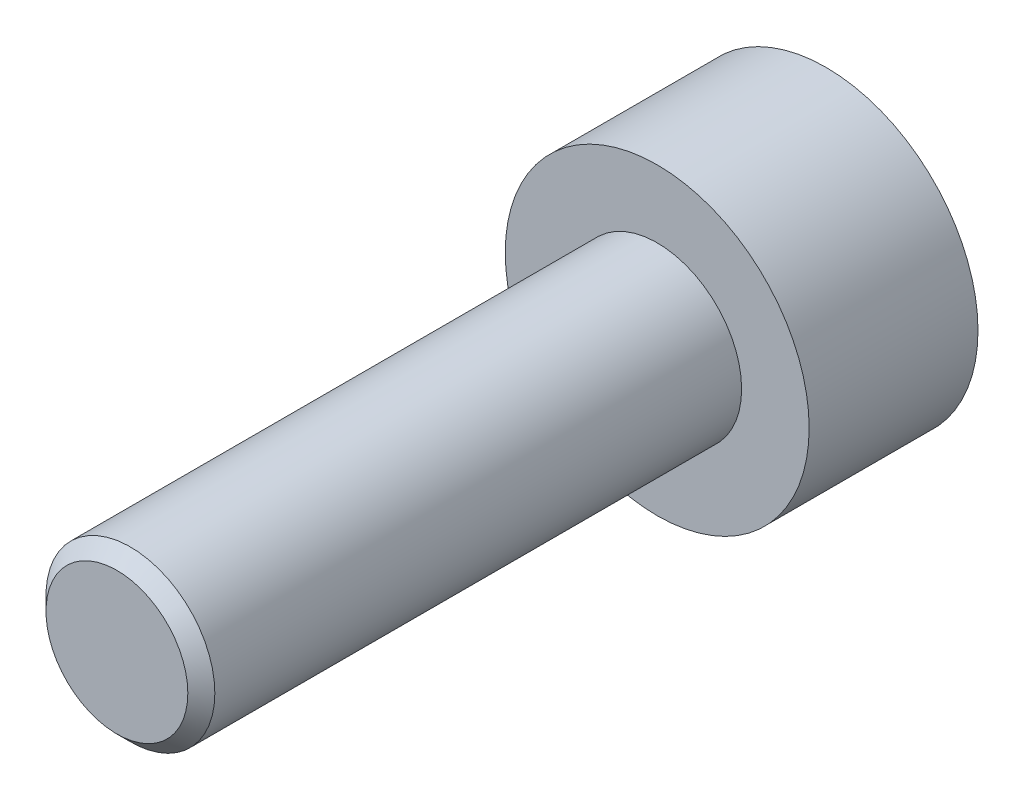
ISO-10303-21;
HEADER;
FILE_DESCRIPTION(('STEP AP214'),'2;1');
FILE_NAME('part.step','',(''),(''),'','','');
FILE_SCHEMA(('AUTOMOTIVE_DESIGN { 1 0 10303 214 1 1 1 1 }'));
ENDSEC;
DATA;
#1=APPLICATION_CONTEXT('core data for automotive mechanical design processes');
#2=APPLICATION_PROTOCOL_DEFINITION('international standard','automotive_design',2000,#1);
#3=PRODUCT_CONTEXT('',#1,'mechanical');
#4=PRODUCT('Part','Part','',(#3));
#5=PRODUCT_RELATED_PRODUCT_CATEGORY('part','',(#4));
#6=PRODUCT_DEFINITION_FORMATION('','',#4);
#7=PRODUCT_DEFINITION_CONTEXT('part definition',#1,'design');
#8=PRODUCT_DEFINITION('design','',#6,#7);
#9=PRODUCT_DEFINITION_SHAPE('','',#8);
#10=(LENGTH_UNIT() NAMED_UNIT(*) SI_UNIT(.MILLI.,.METRE.));
#11=(NAMED_UNIT(*) PLANE_ANGLE_UNIT() SI_UNIT($,.RADIAN.));
#12=(NAMED_UNIT(*) SI_UNIT($,.STERADIAN.) SOLID_ANGLE_UNIT());
#13=UNCERTAINTY_MEASURE_WITH_UNIT(LENGTH_MEASURE(1.E-05),#10,'distance_accuracy_value','');
#14=(GEOMETRIC_REPRESENTATION_CONTEXT(3) GLOBAL_UNCERTAINTY_ASSIGNED_CONTEXT((#13)) GLOBAL_UNIT_ASSIGNED_CONTEXT((#10,
#11,#12)) REPRESENTATION_CONTEXT('',''));
#15=CARTESIAN_POINT('',(0.,0.,0.));
#16=DIRECTION('',(0.,0.,1.));
#17=DIRECTION('',(1.,0.,0.));
#18=AXIS2_PLACEMENT_3D('',#15,#16,#17);
#19=CARTESIAN_POINT('',(0.,0.,2.5));
#20=DIRECTION('',(0.,0.,-1.));
#21=DIRECTION('',(-1.,0.,0.));
#22=AXIS2_PLACEMENT_3D('',#19,#20,#21);
#23=CYLINDRICAL_SURFACE('',#22,2.25);
#24=CARTESIAN_POINT('',(0.,0.,2.5));
#25=DIRECTION('',(0.,0.,1.));
#26=DIRECTION('',(1.,0.,0.));
#27=AXIS2_PLACEMENT_3D('',#24,#25,#26);
#28=CIRCLE('',#27,2.25);
#29=CARTESIAN_POINT('',(2.25,0.,2.5));
#30=VERTEX_POINT('',#29);
#31=EDGE_CURVE('E171',#30,#30,#28,.T.);
#32=ORIENTED_EDGE('',*,*,#31,.F.);
#33=EDGE_LOOP('',(#32));
#34=FACE_BOUND('',#33,.T.);
#35=CARTESIAN_POINT('',(0.,0.,0.));
#36=DIRECTION('',(0.,0.,1.));
#37=DIRECTION('',(1.,0.,0.));
#38=AXIS2_PLACEMENT_3D('',#35,#36,#37);
#39=CIRCLE('',#38,2.25);
#40=CARTESIAN_POINT('',(2.25,0.,0.));
#41=VERTEX_POINT('',#40);
#42=EDGE_CURVE('E157',#41,#41,#39,.T.);
#43=ORIENTED_EDGE('',*,*,#42,.T.);
#44=EDGE_LOOP('',(#43));
#45=FACE_BOUND('',#44,.T.);
#46=ADVANCED_FACE('F41',(#34,#45),#23,.T.);
#47=CARTESIAN_POINT('',(0.,0.,2.5));
#48=DIRECTION('',(0.,0.,1.));
#49=DIRECTION('',(1.,0.,0.));
#50=AXIS2_PLACEMENT_3D('',#47,#48,#49);
#51=PLANE('',#50);
#52=CARTESIAN_POINT('',(0.,0.,2.5));
#53=DIRECTION('',(0.,0.,1.));
#54=DIRECTION('',(1.,0.,0.));
#55=AXIS2_PLACEMENT_3D('',#52,#53,#54);
#56=CIRCLE('',#55,1.25);
#57=CARTESIAN_POINT('',(1.25,0.,2.5));
#58=VERTEX_POINT('',#57);
#59=EDGE_CURVE('E167',#58,#58,#56,.T.);
#60=ORIENTED_EDGE('',*,*,#59,.F.);
#61=EDGE_LOOP('',(#60));
#62=FACE_BOUND('',#61,.T.);
#63=ORIENTED_EDGE('',*,*,#31,.T.);
#64=EDGE_LOOP('',(#63));
#65=FACE_BOUND('',#64,.T.);
#66=ADVANCED_FACE('F196',(#62,#65),#51,.T.);
#67=CARTESIAN_POINT('',(0.,0.,0.));
#68=DIRECTION('',(0.,0.,1.));
#69=DIRECTION('',(1.,0.,0.));
#70=AXIS2_PLACEMENT_3D('',#67,#68,#69);
#71=PLANE('',#70);
#72=DIRECTION('',(0.866025403784439,-0.5,0.));
#73=VECTOR('',#72,1.);
#74=CARTESIAN_POINT('',(0.,1.17779454914684,0.));
#75=LINE('',#74,#73);
#76=CARTESIAN_POINT('',(0.,1.17779454914684,0.));
#77=VERTEX_POINT('',#76);
#78=CARTESIAN_POINT('',(1.02,0.588897274573418,0.));
#79=VERTEX_POINT('',#78);
#80=EDGE_CURVE('E138',#77,#79,#75,.T.);
#81=ORIENTED_EDGE('',*,*,#80,.F.);
#82=DIRECTION('',(0.866025403784439,0.5,0.));
#83=VECTOR('',#82,1.);
#84=CARTESIAN_POINT('',(-1.02,0.588897274573418,0.));
#85=LINE('',#84,#83);
#86=CARTESIAN_POINT('',(-1.02,0.588897274573418,0.));
#87=VERTEX_POINT('',#86);
#88=EDGE_CURVE('E58',#87,#77,#85,.T.);
#89=ORIENTED_EDGE('',*,*,#88,.F.);
#90=DIRECTION('',(0.,1.,0.));
#91=VECTOR('',#90,1.);
#92=CARTESIAN_POINT('',(-1.02,-0.588897274573418,0.));
#93=LINE('',#92,#91);
#94=CARTESIAN_POINT('',(-1.02,-0.588897274573418,0.));
#95=VERTEX_POINT('',#94);
#96=EDGE_CURVE('E151',#95,#87,#93,.T.);
#97=ORIENTED_EDGE('',*,*,#96,.F.);
#98=DIRECTION('',(-0.866025403784439,0.5,0.));
#99=VECTOR('',#98,1.);
#100=CARTESIAN_POINT('',(0.,-1.17779454914684,0.));
#101=LINE('',#100,#99);
#102=CARTESIAN_POINT('',(0.,-1.17779454914684,0.));
#103=VERTEX_POINT('',#102);
#104=EDGE_CURVE('E148',#103,#95,#101,.T.);
#105=ORIENTED_EDGE('',*,*,#104,.F.);
#106=DIRECTION('',(-0.866025403784439,-0.5,0.));
#107=VECTOR('',#106,1.);
#108=CARTESIAN_POINT('',(1.02,-0.588897274573418,0.));
#109=LINE('',#108,#107);
#110=CARTESIAN_POINT('',(1.02,-0.588897274573418,0.));
#111=VERTEX_POINT('',#110);
#112=EDGE_CURVE('E106',#111,#103,#109,.T.);
#113=ORIENTED_EDGE('',*,*,#112,.F.);
#114=DIRECTION('',(0.,-1.,0.));
#115=VECTOR('',#114,1.);
#116=CARTESIAN_POINT('',(1.02,0.588897274573418,0.));
#117=LINE('',#116,#115);
#118=EDGE_CURVE('E142',#79,#111,#117,.T.);
#119=ORIENTED_EDGE('',*,*,#118,.F.);
#120=EDGE_LOOP('',(#81,#89,#97,#105,#113,#119));
#121=FACE_BOUND('',#120,.T.);
#122=ORIENTED_EDGE('',*,*,#42,.F.);
#123=EDGE_LOOP('',(#122));
#124=FACE_BOUND('',#123,.T.);
#125=ADVANCED_FACE('F201',(#121,#124),#71,.F.);
#126=CARTESIAN_POINT('',(0.,0.,10.5));
#127=DIRECTION('',(0.,0.,-1.));
#128=DIRECTION('',(-1.,0.,0.));
#129=AXIS2_PLACEMENT_3D('',#126,#127,#128);
#130=CYLINDRICAL_SURFACE('',#129,1.25);
#131=CARTESIAN_POINT('',(0.,0.,10.3));
#132=DIRECTION('',(0.,0.,1.));
#133=DIRECTION('',(1.,0.,0.));
#134=AXIS2_PLACEMENT_3D('',#131,#132,#133);
#135=CIRCLE('',#134,1.25);
#136=CARTESIAN_POINT('',(1.25,0.,10.3));
#137=VERTEX_POINT('',#136);
#138=EDGE_CURVE('E11',#137,#137,#135,.F.);
#139=ORIENTED_EDGE('',*,*,#138,.T.);
#140=EDGE_LOOP('',(#139));
#141=FACE_BOUND('',#140,.T.);
#142=ORIENTED_EDGE('',*,*,#59,.T.);
#143=EDGE_LOOP('',(#142));
#144=FACE_BOUND('',#143,.T.);
#145=ADVANCED_FACE('F192',(#141,#144),#130,.T.);
#146=CARTESIAN_POINT('',(0.,0.,10.5));
#147=DIRECTION('',(0.,0.,1.));
#148=DIRECTION('',(1.,0.,0.));
#149=AXIS2_PLACEMENT_3D('',#146,#147,#148);
#150=PLANE('',#149);
#151=CARTESIAN_POINT('',(0.,0.,10.5));
#152=DIRECTION('',(0.,0.,1.));
#153=DIRECTION('',(1.,0.,0.));
#154=AXIS2_PLACEMENT_3D('',#151,#152,#153);
#155=CIRCLE('',#154,1.05);
#156=CARTESIAN_POINT('',(1.05,0.,10.5));
#157=VERTEX_POINT('',#156);
#158=EDGE_CURVE('E51',#157,#157,#155,.T.);
#159=ORIENTED_EDGE('',*,*,#158,.T.);
#160=EDGE_LOOP('',(#159));
#161=FACE_BOUND('',#160,.T.);
#162=ADVANCED_FACE('F181',(#161),#150,.T.);
#163=CARTESIAN_POINT('',(0.,0.,10.5));
#164=DIRECTION('',(0.,0.,-1.));
#165=DIRECTION('',(-1.,0.,0.));
#166=AXIS2_PLACEMENT_3D('',#163,#164,#165);
#167=CONICAL_SURFACE('',#166,1.05,0.785398163397446);
#168=ORIENTED_EDGE('',*,*,#138,.F.);
#169=EDGE_LOOP('',(#168));
#170=FACE_BOUND('',#169,.T.);
#171=ORIENTED_EDGE('',*,*,#158,.F.);
#172=EDGE_LOOP('',(#171));
#173=FACE_BOUND('',#172,.T.);
#174=ADVANCED_FACE('F44',(#170,#173),#167,.T.);
#175=CARTESIAN_POINT('',(-1.02,0.588897274573418,1.1));
#176=DIRECTION('',(-0.5,0.866025403784439,0.));
#177=DIRECTION('',(-0.866025403784439,-0.5,0.));
#178=AXIS2_PLACEMENT_3D('',#175,#176,#177);
#179=PLANE('',#178);
#180=ORIENTED_EDGE('',*,*,#88,.T.);
#181=DIRECTION('',(0.,0.,-1.));
#182=VECTOR('',#181,1.);
#183=CARTESIAN_POINT('',(0.,1.17779454914684,1.1));
#184=LINE('',#183,#182);
#185=CARTESIAN_POINT('',(0.,1.17779454914684,1.1));
#186=VERTEX_POINT('',#185);
#187=EDGE_CURVE('E88',#186,#77,#184,.T.);
#188=ORIENTED_EDGE('',*,*,#187,.F.);
#189=DIRECTION('',(0.866025403784439,0.5,0.));
#190=VECTOR('',#189,1.);
#191=CARTESIAN_POINT('',(-1.02,0.588897274573418,1.1));
#192=LINE('',#191,#190);
#193=CARTESIAN_POINT('',(-1.02,0.588897274573418,1.1));
#194=VERTEX_POINT('',#193);
#195=EDGE_CURVE('E154',#194,#186,#192,.T.);
#196=ORIENTED_EDGE('',*,*,#195,.F.);
#197=DIRECTION('',(0.,0.,-1.));
#198=VECTOR('',#197,1.);
#199=CARTESIAN_POINT('',(-1.02,0.588897274573418,1.1));
#200=LINE('',#199,#198);
#201=EDGE_CURVE('E66',#194,#87,#200,.T.);
#202=ORIENTED_EDGE('',*,*,#201,.T.);
#203=EDGE_LOOP('',(#180,#188,#196,#202));
#204=FACE_BOUND('',#203,.T.);
#205=ADVANCED_FACE('F184',(#204),#179,.F.);
#206=CARTESIAN_POINT('',(-1.02,-0.588897274573418,1.1));
#207=DIRECTION('',(-1.,0.,0.));
#208=DIRECTION('',(0.,0.,1.));
#209=AXIS2_PLACEMENT_3D('',#206,#207,#208);
#210=PLANE('',#209);
#211=ORIENTED_EDGE('',*,*,#96,.T.);
#212=ORIENTED_EDGE('',*,*,#201,.F.);
#213=DIRECTION('',(0.,1.,0.));
#214=VECTOR('',#213,1.);
#215=CARTESIAN_POINT('',(-1.02,-0.588897274573418,1.1));
#216=LINE('',#215,#214);
#217=CARTESIAN_POINT('',(-1.02,-0.588897274573418,1.1));
#218=VERTEX_POINT('',#217);
#219=EDGE_CURVE('E120',#218,#194,#216,.T.);
#220=ORIENTED_EDGE('',*,*,#219,.F.);
#221=DIRECTION('',(0.,0.,-1.));
#222=VECTOR('',#221,1.);
#223=CARTESIAN_POINT('',(-1.02,-0.588897274573418,1.1));
#224=LINE('',#223,#222);
#225=EDGE_CURVE('E111',#218,#95,#224,.T.);
#226=ORIENTED_EDGE('',*,*,#225,.T.);
#227=EDGE_LOOP('',(#211,#212,#220,#226));
#228=FACE_BOUND('',#227,.T.);
#229=ADVANCED_FACE('F190',(#228),#210,.F.);
#230=CARTESIAN_POINT('',(0.,-1.17779454914684,1.1));
#231=DIRECTION('',(-0.5,-0.866025403784439,0.));
#232=DIRECTION('',(0.866025403784439,-0.5,0.));
#233=AXIS2_PLACEMENT_3D('',#230,#231,#232);
#234=PLANE('',#233);
#235=ORIENTED_EDGE('',*,*,#104,.T.);
#236=ORIENTED_EDGE('',*,*,#225,.F.);
#237=DIRECTION('',(-0.866025403784439,0.5,0.));
#238=VECTOR('',#237,1.);
#239=CARTESIAN_POINT('',(0.,-1.17779454914684,1.1));
#240=LINE('',#239,#238);
#241=CARTESIAN_POINT('',(0.,-1.17779454914684,1.1));
#242=VERTEX_POINT('',#241);
#243=EDGE_CURVE('E115',#242,#218,#240,.T.);
#244=ORIENTED_EDGE('',*,*,#243,.F.);
#245=DIRECTION('',(0.,0.,-1.));
#246=VECTOR('',#245,1.);
#247=CARTESIAN_POINT('',(0.,-1.17779454914684,1.1));
#248=LINE('',#247,#246);
#249=EDGE_CURVE('E99',#242,#103,#248,.T.);
#250=ORIENTED_EDGE('',*,*,#249,.T.);
#251=EDGE_LOOP('',(#235,#236,#244,#250));
#252=FACE_BOUND('',#251,.T.);
#253=ADVANCED_FACE('F116',(#252),#234,.F.);
#254=CARTESIAN_POINT('',(1.02,-0.588897274573418,1.1));
#255=DIRECTION('',(0.5,-0.866025403784439,0.));
#256=DIRECTION('',(0.866025403784439,0.5,0.));
#257=AXIS2_PLACEMENT_3D('',#254,#255,#256);
#258=PLANE('',#257);
#259=ORIENTED_EDGE('',*,*,#112,.T.);
#260=ORIENTED_EDGE('',*,*,#249,.F.);
#261=DIRECTION('',(-0.866025403784439,-0.5,0.));
#262=VECTOR('',#261,1.);
#263=CARTESIAN_POINT('',(1.02,-0.588897274573418,1.1));
#264=LINE('',#263,#262);
#265=CARTESIAN_POINT('',(1.02,-0.588897274573418,1.1));
#266=VERTEX_POINT('',#265);
#267=EDGE_CURVE('E103',#266,#242,#264,.T.);
#268=ORIENTED_EDGE('',*,*,#267,.F.);
#269=DIRECTION('',(0.,0.,-1.));
#270=VECTOR('',#269,1.);
#271=CARTESIAN_POINT('',(1.02,-0.588897274573418,1.1));
#272=LINE('',#271,#270);
#273=EDGE_CURVE('E112',#266,#111,#272,.T.);
#274=ORIENTED_EDGE('',*,*,#273,.T.);
#275=EDGE_LOOP('',(#259,#260,#268,#274));
#276=FACE_BOUND('',#275,.T.);
#277=ADVANCED_FACE('F101',(#276),#258,.F.);
#278=CARTESIAN_POINT('',(1.02,0.588897274573418,1.1));
#279=DIRECTION('',(1.,0.,0.));
#280=DIRECTION('',(0.,0.,-1.));
#281=AXIS2_PLACEMENT_3D('',#278,#279,#280);
#282=PLANE('',#281);
#283=ORIENTED_EDGE('',*,*,#118,.T.);
#284=ORIENTED_EDGE('',*,*,#273,.F.);
#285=DIRECTION('',(0.,-1.,0.));
#286=VECTOR('',#285,1.);
#287=CARTESIAN_POINT('',(1.02,0.588897274573418,1.1));
#288=LINE('',#287,#286);
#289=CARTESIAN_POINT('',(1.02,0.588897274573418,1.1));
#290=VERTEX_POINT('',#289);
#291=EDGE_CURVE('E126',#290,#266,#288,.T.);
#292=ORIENTED_EDGE('',*,*,#291,.F.);
#293=DIRECTION('',(0.,0.,-1.));
#294=VECTOR('',#293,1.);
#295=CARTESIAN_POINT('',(1.02,0.588897274573418,1.1));
#296=LINE('',#295,#294);
#297=EDGE_CURVE('E162',#290,#79,#296,.T.);
#298=ORIENTED_EDGE('',*,*,#297,.T.);
#299=EDGE_LOOP('',(#283,#284,#292,#298));
#300=FACE_BOUND('',#299,.T.);
#301=ADVANCED_FACE('F216',(#300),#282,.F.);
#302=CARTESIAN_POINT('',(0.,1.17779454914684,1.1));
#303=DIRECTION('',(0.5,0.866025403784439,0.));
#304=DIRECTION('',(-0.866025403784439,0.5,0.));
#305=AXIS2_PLACEMENT_3D('',#302,#303,#304);
#306=PLANE('',#305);
#307=ORIENTED_EDGE('',*,*,#80,.T.);
#308=ORIENTED_EDGE('',*,*,#297,.F.);
#309=DIRECTION('',(0.866025403784439,-0.5,0.));
#310=VECTOR('',#309,1.);
#311=CARTESIAN_POINT('',(0.,1.17779454914684,1.1));
#312=LINE('',#311,#310);
#313=EDGE_CURVE('E130',#186,#290,#312,.T.);
#314=ORIENTED_EDGE('',*,*,#313,.F.);
#315=ORIENTED_EDGE('',*,*,#187,.T.);
#316=EDGE_LOOP('',(#307,#308,#314,#315));
#317=FACE_BOUND('',#316,.T.);
#318=ADVANCED_FACE('F213',(#317),#306,.F.);
#319=CARTESIAN_POINT('',(0.,0.,1.1));
#320=DIRECTION('',(0.,0.,-1.));
#321=DIRECTION('',(-1.,0.,0.));
#322=AXIS2_PLACEMENT_3D('',#319,#320,#321);
#323=PLANE('',#322);
#324=ORIENTED_EDGE('',*,*,#195,.T.);
#325=ORIENTED_EDGE('',*,*,#313,.T.);
#326=ORIENTED_EDGE('',*,*,#291,.T.);
#327=ORIENTED_EDGE('',*,*,#267,.T.);
#328=ORIENTED_EDGE('',*,*,#243,.T.);
#329=ORIENTED_EDGE('',*,*,#219,.T.);
#330=EDGE_LOOP('',(#324,#325,#326,#327,#328,#329));
#331=FACE_BOUND('',#330,.T.);
#332=ADVANCED_FACE('F123',(#331),#323,.T.);
#333=CLOSED_SHELL('',(#46,#66,#125,#145,#162,#174,#205,#229,#253,#277,#301,#318,#332));
#334=MANIFOLD_SOLID_BREP('B2',#333);
#335=ADVANCED_BREP_SHAPE_REPRESENTATION('',(#18,#334),#14);
#336=SHAPE_DEFINITION_REPRESENTATION(#9,#335);
ENDSEC;
END-ISO-10303-21;
